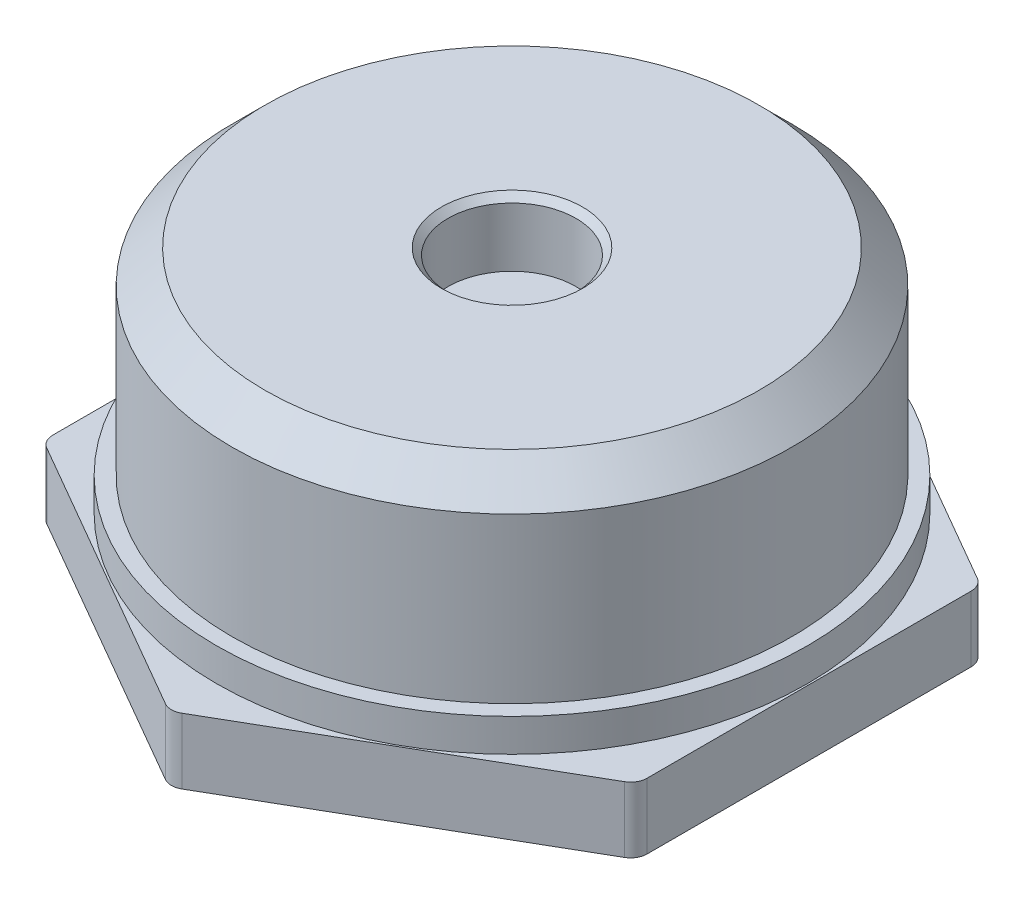
ISO-10303-21;
HEADER;
FILE_DESCRIPTION(('STEP AP214'),'2;1');
FILE_NAME('part.step','',(''),(''),'','','');
FILE_SCHEMA(('AUTOMOTIVE_DESIGN { 1 0 10303 214 1 1 1 1 }'));
ENDSEC;
DATA;
#1=APPLICATION_CONTEXT('core data for automotive mechanical design processes');
#2=APPLICATION_PROTOCOL_DEFINITION('international standard','automotive_design',2000,#1);
#3=PRODUCT_CONTEXT('',#1,'mechanical');
#4=PRODUCT('Part','Part','',(#3));
#5=PRODUCT_RELATED_PRODUCT_CATEGORY('part','',(#4));
#6=PRODUCT_DEFINITION_FORMATION('','',#4);
#7=PRODUCT_DEFINITION_CONTEXT('part definition',#1,'design');
#8=PRODUCT_DEFINITION('design','',#6,#7);
#9=PRODUCT_DEFINITION_SHAPE('','',#8);
#10=(LENGTH_UNIT() NAMED_UNIT(*) SI_UNIT(.MILLI.,.METRE.));
#11=(NAMED_UNIT(*) PLANE_ANGLE_UNIT() SI_UNIT($,.RADIAN.));
#12=(NAMED_UNIT(*) SI_UNIT($,.STERADIAN.) SOLID_ANGLE_UNIT());
#13=UNCERTAINTY_MEASURE_WITH_UNIT(LENGTH_MEASURE(1.E-05),#10,'distance_accuracy_value','');
#14=(GEOMETRIC_REPRESENTATION_CONTEXT(3) GLOBAL_UNCERTAINTY_ASSIGNED_CONTEXT((#13)) GLOBAL_UNIT_ASSIGNED_CONTEXT((#10,
#11,#12)) REPRESENTATION_CONTEXT('',''));
#15=CARTESIAN_POINT('',(0.,0.,0.));
#16=DIRECTION('',(0.,0.,1.));
#17=DIRECTION('',(1.,0.,0.));
#18=AXIS2_PLACEMENT_3D('',#15,#16,#17);
#19=CARTESIAN_POINT('',(2.5,31.,-1.44337567297407));
#20=DIRECTION('',(0.5,0.,-0.866025403784439));
#21=DIRECTION('',(-0.866025403784439,0.,-0.5));
#22=AXIS2_PLACEMENT_3D('',#19,#20,#21);
#23=PLANE('',#22);
#24=DIRECTION('',(0.866025403784439,0.,0.5));
#25=VECTOR('',#24,1.);
#26=CARTESIAN_POINT('',(2.5,37.,-1.44337567297407));
#27=LINE('',#26,#25);
#28=CARTESIAN_POINT('',(0.,37.,-2.88675134594813));
#29=VERTEX_POINT('',#28);
#30=CARTESIAN_POINT('',(2.5,37.,-1.44337567297407));
#31=VERTEX_POINT('',#30);
#32=EDGE_CURVE('E193',#29,#31,#27,.T.);
#33=ORIENTED_EDGE('',*,*,#32,.F.);
#34=DIRECTION('',(0.,1.,0.));
#35=VECTOR('',#34,1.);
#36=CARTESIAN_POINT('',(0.,31.,-2.88675134594813));
#37=LINE('',#36,#35);
#38=CARTESIAN_POINT('',(0.,31.,-2.88675134594813));
#39=VERTEX_POINT('',#38);
#40=EDGE_CURVE('E177',#39,#29,#37,.T.);
#41=ORIENTED_EDGE('',*,*,#40,.F.);
#42=DIRECTION('',(-0.866025403784439,0.,-0.5));
#43=VECTOR('',#42,1.);
#44=CARTESIAN_POINT('',(2.5,31.,-1.44337567297407));
#45=LINE('',#44,#43);
#46=CARTESIAN_POINT('',(2.5,31.,-1.44337567297407));
#47=VERTEX_POINT('',#46);
#48=EDGE_CURVE('E196',#47,#39,#45,.T.);
#49=ORIENTED_EDGE('',*,*,#48,.F.);
#50=DIRECTION('',(0.,1.,0.));
#51=VECTOR('',#50,1.);
#52=CARTESIAN_POINT('',(2.5,31.,-1.44337567297407));
#53=LINE('',#52,#51);
#54=EDGE_CURVE('E194',#47,#31,#53,.T.);
#55=ORIENTED_EDGE('',*,*,#54,.T.);
#56=EDGE_LOOP('',(#33,#41,#49,#55));
#57=FACE_BOUND('',#56,.T.);
#58=ADVANCED_FACE('F47',(#57),#23,.F.);
#59=CARTESIAN_POINT('',(2.5,31.,1.44337567297406));
#60=DIRECTION('',(1.,0.,0.));
#61=DIRECTION('',(0.,0.,-1.));
#62=AXIS2_PLACEMENT_3D('',#59,#60,#61);
#63=PLANE('',#62);
#64=DIRECTION('',(0.,0.,1.));
#65=VECTOR('',#64,1.);
#66=CARTESIAN_POINT('',(2.5,37.,1.44337567297406));
#67=LINE('',#66,#65);
#68=CARTESIAN_POINT('',(2.5,37.,1.44337567297406));
#69=VERTEX_POINT('',#68);
#70=EDGE_CURVE('E64',#31,#69,#67,.T.);
#71=ORIENTED_EDGE('',*,*,#70,.F.);
#72=ORIENTED_EDGE('',*,*,#54,.F.);
#73=DIRECTION('',(0.,0.,-1.));
#74=VECTOR('',#73,1.);
#75=CARTESIAN_POINT('',(2.5,31.,1.44337567297406));
#76=LINE('',#75,#74);
#77=CARTESIAN_POINT('',(2.5,31.,1.44337567297406));
#78=VERTEX_POINT('',#77);
#79=EDGE_CURVE('E190',#78,#47,#76,.T.);
#80=ORIENTED_EDGE('',*,*,#79,.F.);
#81=DIRECTION('',(0.,1.,0.));
#82=VECTOR('',#81,1.);
#83=CARTESIAN_POINT('',(2.5,31.,1.44337567297406));
#84=LINE('',#83,#82);
#85=EDGE_CURVE('E344',#78,#69,#84,.T.);
#86=ORIENTED_EDGE('',*,*,#85,.T.);
#87=EDGE_LOOP('',(#71,#72,#80,#86));
#88=FACE_BOUND('',#87,.T.);
#89=ADVANCED_FACE('F238',(#88),#63,.F.);
#90=CARTESIAN_POINT('',(0.,31.,2.88675134594813));
#91=DIRECTION('',(0.5,0.,0.866025403784439));
#92=DIRECTION('',(0.866025403784439,0.,-0.5));
#93=AXIS2_PLACEMENT_3D('',#90,#91,#92);
#94=PLANE('',#93);
#95=DIRECTION('',(-0.866025403784439,0.,0.5));
#96=VECTOR('',#95,1.);
#97=CARTESIAN_POINT('',(0.,37.,2.88675134594813));
#98=LINE('',#97,#96);
#99=CARTESIAN_POINT('',(0.,37.,2.88675134594813));
#100=VERTEX_POINT('',#99);
#101=EDGE_CURVE('E75',#69,#100,#98,.T.);
#102=ORIENTED_EDGE('',*,*,#101,.F.);
#103=ORIENTED_EDGE('',*,*,#85,.F.);
#104=DIRECTION('',(0.866025403784439,0.,-0.5));
#105=VECTOR('',#104,1.);
#106=CARTESIAN_POINT('',(0.,31.,2.88675134594813));
#107=LINE('',#106,#105);
#108=CARTESIAN_POINT('',(0.,31.,2.88675134594813));
#109=VERTEX_POINT('',#108);
#110=EDGE_CURVE('E468',#109,#78,#107,.T.);
#111=ORIENTED_EDGE('',*,*,#110,.F.);
#112=DIRECTION('',(0.,1.,0.));
#113=VECTOR('',#112,1.);
#114=CARTESIAN_POINT('',(0.,31.,2.88675134594813));
#115=LINE('',#114,#113);
#116=EDGE_CURVE('E480',#109,#100,#115,.T.);
#117=ORIENTED_EDGE('',*,*,#116,.T.);
#118=EDGE_LOOP('',(#102,#103,#111,#117));
#119=FACE_BOUND('',#118,.T.);
#120=ADVANCED_FACE('F244',(#119),#94,.F.);
#121=CARTESIAN_POINT('',(-2.5,31.,1.44337567297407));
#122=DIRECTION('',(-0.5,0.,0.866025403784439));
#123=DIRECTION('',(0.866025403784439,0.,0.5));
#124=AXIS2_PLACEMENT_3D('',#121,#122,#123);
#125=PLANE('',#124);
#126=DIRECTION('',(-0.866025403784439,0.,-0.5));
#127=VECTOR('',#126,1.);
#128=CARTESIAN_POINT('',(-2.5,37.,1.44337567297407));
#129=LINE('',#128,#127);
#130=CARTESIAN_POINT('',(-2.5,37.,1.44337567297407));
#131=VERTEX_POINT('',#130);
#132=EDGE_CURVE('E474',#100,#131,#129,.T.);
#133=ORIENTED_EDGE('',*,*,#132,.F.);
#134=ORIENTED_EDGE('',*,*,#116,.F.);
#135=DIRECTION('',(0.866025403784439,0.,0.5));
#136=VECTOR('',#135,1.);
#137=CARTESIAN_POINT('',(-2.5,31.,1.44337567297407));
#138=LINE('',#137,#136);
#139=CARTESIAN_POINT('',(-2.5,31.,1.44337567297407));
#140=VERTEX_POINT('',#139);
#141=EDGE_CURVE('E471',#140,#109,#138,.T.);
#142=ORIENTED_EDGE('',*,*,#141,.F.);
#143=DIRECTION('',(0.,1.,0.));
#144=VECTOR('',#143,1.);
#145=CARTESIAN_POINT('',(-2.5,31.,1.44337567297407));
#146=LINE('',#145,#144);
#147=EDGE_CURVE('E497',#140,#131,#146,.T.);
#148=ORIENTED_EDGE('',*,*,#147,.T.);
#149=EDGE_LOOP('',(#133,#134,#142,#148));
#150=FACE_BOUND('',#149,.T.);
#151=ADVANCED_FACE('F507',(#150),#125,.F.);
#152=CARTESIAN_POINT('',(-2.5,31.,-1.44337567297406));
#153=DIRECTION('',(-1.,0.,0.));
#154=DIRECTION('',(0.,0.,1.));
#155=AXIS2_PLACEMENT_3D('',#152,#153,#154);
#156=PLANE('',#155);
#157=DIRECTION('',(0.,0.,-1.));
#158=VECTOR('',#157,1.);
#159=CARTESIAN_POINT('',(-2.5,37.,-1.44337567297406));
#160=LINE('',#159,#158);
#161=CARTESIAN_POINT('',(-2.5,37.,-1.44337567297406));
#162=VERTEX_POINT('',#161);
#163=EDGE_CURVE('E201',#131,#162,#160,.T.);
#164=ORIENTED_EDGE('',*,*,#163,.F.);
#165=ORIENTED_EDGE('',*,*,#147,.F.);
#166=DIRECTION('',(0.,0.,1.));
#167=VECTOR('',#166,1.);
#168=CARTESIAN_POINT('',(-2.5,31.,-1.44337567297406));
#169=LINE('',#168,#167);
#170=CARTESIAN_POINT('',(-2.5,31.,-1.44337567297406));
#171=VERTEX_POINT('',#170);
#172=EDGE_CURVE('E487',#171,#140,#169,.T.);
#173=ORIENTED_EDGE('',*,*,#172,.F.);
#174=DIRECTION('',(0.,1.,0.));
#175=VECTOR('',#174,1.);
#176=CARTESIAN_POINT('',(-2.5,31.,-1.44337567297406));
#177=LINE('',#176,#175);
#178=EDGE_CURVE('E189',#171,#162,#177,.T.);
#179=ORIENTED_EDGE('',*,*,#178,.T.);
#180=EDGE_LOOP('',(#164,#165,#173,#179));
#181=FACE_BOUND('',#180,.T.);
#182=ADVANCED_FACE('F502',(#181),#156,.F.);
#183=CARTESIAN_POINT('',(0.,31.,-2.88675134594813));
#184=DIRECTION('',(-0.5,0.,-0.866025403784439));
#185=DIRECTION('',(-0.866025403784439,0.,0.5));
#186=AXIS2_PLACEMENT_3D('',#183,#184,#185);
#187=PLANE('',#186);
#188=DIRECTION('',(0.866025403784439,0.,-0.5));
#189=VECTOR('',#188,1.);
#190=CARTESIAN_POINT('',(0.,37.,-2.88675134594813));
#191=LINE('',#190,#189);
#192=EDGE_CURVE('E182',#162,#29,#191,.T.);
#193=ORIENTED_EDGE('',*,*,#192,.F.);
#194=ORIENTED_EDGE('',*,*,#178,.F.);
#195=DIRECTION('',(-0.866025403784439,0.,0.5));
#196=VECTOR('',#195,1.);
#197=CARTESIAN_POINT('',(0.,31.,-2.88675134594813));
#198=LINE('',#197,#196);
#199=EDGE_CURVE('E185',#39,#171,#198,.T.);
#200=ORIENTED_EDGE('',*,*,#199,.F.);
#201=ORIENTED_EDGE('',*,*,#40,.T.);
#202=EDGE_LOOP('',(#193,#194,#200,#201));
#203=FACE_BOUND('',#202,.T.);
#204=ADVANCED_FACE('F179',(#203),#187,.F.);
#205=CARTESIAN_POINT('',(9.05,33.,-5.22501993616611));
#206=DIRECTION('',(-0.5,0.,0.866025403784439));
#207=DIRECTION('',(0.866025403784439,0.,0.5));
#208=AXIS2_PLACEMENT_3D('',#205,#206,#207);
#209=PLANE('',#208);
#210=DIRECTION('',(-0.866025403784439,0.,-0.5));
#211=VECTOR('',#210,1.);
#212=CARTESIAN_POINT('',(9.05,31.,-5.22501993616611));
#213=LINE('',#212,#211);
#214=CARTESIAN_POINT('',(8.8,31.,-5.36935750346352));
#215=VERTEX_POINT('',#214);
#216=CARTESIAN_POINT('',(0.249999999999997,31.,-10.3057023050348));
#217=VERTEX_POINT('',#216);
#218=EDGE_CURVE('E338',#215,#217,#213,.T.);
#219=ORIENTED_EDGE('',*,*,#218,.T.);
#220=DIRECTION('',(0.,-1.,0.));
#221=VECTOR('',#220,1.);
#222=CARTESIAN_POINT('',(0.249999999999997,33.,-10.3057023050348));
#223=LINE('',#222,#221);
#224=CARTESIAN_POINT('',(0.249999999999997,33.,-10.3057023050348));
#225=VERTEX_POINT('',#224);
#226=EDGE_CURVE('E405',#217,#225,#223,.F.);
#227=ORIENTED_EDGE('',*,*,#226,.T.);
#228=DIRECTION('',(-0.866025403784439,0.,-0.5));
#229=VECTOR('',#228,1.);
#230=CARTESIAN_POINT('',(9.05,33.,-5.22501993616611));
#231=LINE('',#230,#229);
#232=CARTESIAN_POINT('',(8.8,33.,-5.36935750346352));
#233=VERTEX_POINT('',#232);
#234=EDGE_CURVE('E349',#233,#225,#231,.T.);
#235=ORIENTED_EDGE('',*,*,#234,.F.);
#236=DIRECTION('',(0.,-1.,0.));
#237=VECTOR('',#236,1.);
#238=CARTESIAN_POINT('',(8.8,33.,-5.36935750346352));
#239=LINE('',#238,#237);
#240=EDGE_CURVE('E402',#233,#215,#239,.T.);
#241=ORIENTED_EDGE('',*,*,#240,.T.);
#242=EDGE_LOOP('',(#219,#227,#235,#241));
#243=FACE_BOUND('',#242,.T.);
#244=ADVANCED_FACE('F290',(#243),#209,.F.);
#245=CARTESIAN_POINT('',(0.,33.,-10.4500398723322));
#246=DIRECTION('',(0.5,0.,0.866025403784439));
#247=DIRECTION('',(0.866025403784439,0.,-0.5));
#248=AXIS2_PLACEMENT_3D('',#245,#246,#247);
#249=PLANE('',#248);
#250=DIRECTION('',(-0.866025403784439,0.,0.5));
#251=VECTOR('',#250,1.);
#252=CARTESIAN_POINT('',(0.,33.,-10.4500398723322));
#253=LINE('',#252,#251);
#254=CARTESIAN_POINT('',(-0.250000000000002,33.,-10.3057023050348));
#255=VERTEX_POINT('',#254);
#256=CARTESIAN_POINT('',(-8.8,33.,-5.36935750346352));
#257=VERTEX_POINT('',#256);
#258=EDGE_CURVE('E352',#255,#257,#253,.T.);
#259=ORIENTED_EDGE('',*,*,#258,.F.);
#260=DIRECTION('',(0.,-1.,0.));
#261=VECTOR('',#260,1.);
#262=CARTESIAN_POINT('',(-0.250000000000002,33.,-10.3057023050348));
#263=LINE('',#262,#261);
#264=CARTESIAN_POINT('',(-0.250000000000002,31.,-10.3057023050348));
#265=VERTEX_POINT('',#264);
#266=EDGE_CURVE('E387',#255,#265,#263,.T.);
#267=ORIENTED_EDGE('',*,*,#266,.T.);
#268=DIRECTION('',(-0.866025403784439,0.,0.5));
#269=VECTOR('',#268,1.);
#270=CARTESIAN_POINT('',(0.,31.,-10.4500398723322));
#271=LINE('',#270,#269);
#272=CARTESIAN_POINT('',(-8.8,31.,-5.36935750346352));
#273=VERTEX_POINT('',#272);
#274=EDGE_CURVE('E342',#265,#273,#271,.T.);
#275=ORIENTED_EDGE('',*,*,#274,.T.);
#276=DIRECTION('',(0.,-1.,0.));
#277=VECTOR('',#276,1.);
#278=CARTESIAN_POINT('',(-8.8,33.,-5.36935750346352));
#279=LINE('',#278,#277);
#280=EDGE_CURVE('E369',#273,#257,#279,.F.);
#281=ORIENTED_EDGE('',*,*,#280,.T.);
#282=EDGE_LOOP('',(#259,#267,#275,#281));
#283=FACE_BOUND('',#282,.T.);
#284=ADVANCED_FACE('F286',(#283),#249,.F.);
#285=CARTESIAN_POINT('',(-9.05,33.,-5.22501993616612));
#286=DIRECTION('',(1.,0.,0.));
#287=DIRECTION('',(0.,0.,-1.));
#288=AXIS2_PLACEMENT_3D('',#285,#286,#287);
#289=PLANE('',#288);
#290=DIRECTION('',(0.,0.,1.));
#291=VECTOR('',#290,1.);
#292=CARTESIAN_POINT('',(-9.05,33.,-5.22501993616612));
#293=LINE('',#292,#291);
#294=CARTESIAN_POINT('',(-9.05,33.,-4.9363448015713));
#295=VERTEX_POINT('',#294);
#296=CARTESIAN_POINT('',(-9.05,33.,4.9363448015713));
#297=VERTEX_POINT('',#296);
#298=EDGE_CURVE('E357',#295,#297,#293,.T.);
#299=ORIENTED_EDGE('',*,*,#298,.F.);
#300=DIRECTION('',(0.,-1.,0.));
#301=VECTOR('',#300,1.);
#302=CARTESIAN_POINT('',(-9.05,33.,-4.9363448015713));
#303=LINE('',#302,#301);
#304=CARTESIAN_POINT('',(-9.05,31.,-4.9363448015713));
#305=VERTEX_POINT('',#304);
#306=EDGE_CURVE('E421',#295,#305,#303,.T.);
#307=ORIENTED_EDGE('',*,*,#306,.T.);
#308=DIRECTION('',(0.,0.,1.));
#309=VECTOR('',#308,1.);
#310=CARTESIAN_POINT('',(-9.05,31.,-5.22501993616612));
#311=LINE('',#310,#309);
#312=CARTESIAN_POINT('',(-9.05,31.,4.9363448015713));
#313=VERTEX_POINT('',#312);
#314=EDGE_CURVE('E374',#305,#313,#311,.T.);
#315=ORIENTED_EDGE('',*,*,#314,.T.);
#316=DIRECTION('',(0.,-1.,0.));
#317=VECTOR('',#316,1.);
#318=CARTESIAN_POINT('',(-9.05,33.,4.9363448015713));
#319=LINE('',#318,#317);
#320=EDGE_CURVE('E419',#313,#297,#319,.F.);
#321=ORIENTED_EDGE('',*,*,#320,.T.);
#322=EDGE_LOOP('',(#299,#307,#315,#321));
#323=FACE_BOUND('',#322,.T.);
#324=ADVANCED_FACE('F282',(#323),#289,.F.);
#325=CARTESIAN_POINT('',(-9.05,33.,5.22501993616611));
#326=DIRECTION('',(0.5,0.,-0.866025403784439));
#327=DIRECTION('',(-0.866025403784439,0.,-0.5));
#328=AXIS2_PLACEMENT_3D('',#325,#326,#327);
#329=PLANE('',#328);
#330=DIRECTION('',(0.866025403784439,0.,0.5));
#331=VECTOR('',#330,1.);
#332=CARTESIAN_POINT('',(-9.05,33.,5.22501993616611));
#333=LINE('',#332,#331);
#334=CARTESIAN_POINT('',(-8.8,33.,5.36935750346352));
#335=VERTEX_POINT('',#334);
#336=CARTESIAN_POINT('',(-0.25,33.,10.3057023050348));
#337=VERTEX_POINT('',#336);
#338=EDGE_CURVE('E360',#335,#337,#333,.T.);
#339=ORIENTED_EDGE('',*,*,#338,.F.);
#340=DIRECTION('',(0.,-1.,0.));
#341=VECTOR('',#340,1.);
#342=CARTESIAN_POINT('',(-8.8,33.,5.36935750346352));
#343=LINE('',#342,#341);
#344=CARTESIAN_POINT('',(-8.8,31.,5.36935750346352));
#345=VERTEX_POINT('',#344);
#346=EDGE_CURVE('E426',#335,#345,#343,.T.);
#347=ORIENTED_EDGE('',*,*,#346,.T.);
#348=DIRECTION('',(0.866025403784439,0.,0.5));
#349=VECTOR('',#348,1.);
#350=CARTESIAN_POINT('',(-9.05,31.,5.22501993616611));
#351=LINE('',#350,#349);
#352=CARTESIAN_POINT('',(-0.25,31.,10.3057023050348));
#353=VERTEX_POINT('',#352);
#354=EDGE_CURVE('E377',#345,#353,#351,.T.);
#355=ORIENTED_EDGE('',*,*,#354,.T.);
#356=DIRECTION('',(0.,-1.,0.));
#357=VECTOR('',#356,1.);
#358=CARTESIAN_POINT('',(-0.250000000000002,33.,10.3057023050348));
#359=LINE('',#358,#357);
#360=EDGE_CURVE('E424',#353,#337,#359,.F.);
#361=ORIENTED_EDGE('',*,*,#360,.T.);
#362=EDGE_LOOP('',(#339,#347,#355,#361));
#363=FACE_BOUND('',#362,.T.);
#364=ADVANCED_FACE('F278',(#363),#329,.F.);
#365=CARTESIAN_POINT('',(0.,33.,10.4500398723322));
#366=DIRECTION('',(-0.5,0.,-0.866025403784439));
#367=DIRECTION('',(-0.866025403784439,0.,0.5));
#368=AXIS2_PLACEMENT_3D('',#365,#366,#367);
#369=PLANE('',#368);
#370=DIRECTION('',(0.866025403784439,0.,-0.5));
#371=VECTOR('',#370,1.);
#372=CARTESIAN_POINT('',(0.,33.,10.4500398723322));
#373=LINE('',#372,#371);
#374=CARTESIAN_POINT('',(0.249999999999999,33.,10.3057023050348));
#375=VERTEX_POINT('',#374);
#376=CARTESIAN_POINT('',(8.8,33.,5.36935750346352));
#377=VERTEX_POINT('',#376);
#378=EDGE_CURVE('E363',#375,#377,#373,.T.);
#379=ORIENTED_EDGE('',*,*,#378,.F.);
#380=DIRECTION('',(0.,-1.,0.));
#381=VECTOR('',#380,1.);
#382=CARTESIAN_POINT('',(0.249999999999999,33.,10.3057023050348));
#383=LINE('',#382,#381);
#384=CARTESIAN_POINT('',(0.249999999999999,31.,10.3057023050348));
#385=VERTEX_POINT('',#384);
#386=EDGE_CURVE('E431',#375,#385,#383,.T.);
#387=ORIENTED_EDGE('',*,*,#386,.T.);
#388=DIRECTION('',(0.866025403784439,0.,-0.5));
#389=VECTOR('',#388,1.);
#390=CARTESIAN_POINT('',(0.,31.,10.4500398723322));
#391=LINE('',#390,#389);
#392=CARTESIAN_POINT('',(8.8,31.,5.36935750346352));
#393=VERTEX_POINT('',#392);
#394=EDGE_CURVE('E380',#385,#393,#391,.T.);
#395=ORIENTED_EDGE('',*,*,#394,.T.);
#396=DIRECTION('',(0.,-1.,0.));
#397=VECTOR('',#396,1.);
#398=CARTESIAN_POINT('',(8.8,33.,5.36935750346352));
#399=LINE('',#398,#397);
#400=EDGE_CURVE('E429',#393,#377,#399,.F.);
#401=ORIENTED_EDGE('',*,*,#400,.T.);
#402=EDGE_LOOP('',(#379,#387,#395,#401));
#403=FACE_BOUND('',#402,.T.);
#404=ADVANCED_FACE('F274',(#403),#369,.F.);
#405=CARTESIAN_POINT('',(9.05,33.,5.22501993616611));
#406=DIRECTION('',(-1.,0.,0.));
#407=DIRECTION('',(0.,0.,1.));
#408=AXIS2_PLACEMENT_3D('',#405,#406,#407);
#409=PLANE('',#408);
#410=DIRECTION('',(0.,0.,-1.));
#411=VECTOR('',#410,1.);
#412=CARTESIAN_POINT('',(9.05,33.,5.22501993616611));
#413=LINE('',#412,#411);
#414=CARTESIAN_POINT('',(9.05,33.,4.9363448015713));
#415=VERTEX_POINT('',#414);
#416=CARTESIAN_POINT('',(9.05,33.,-4.9363448015713));
#417=VERTEX_POINT('',#416);
#418=EDGE_CURVE('E367',#415,#417,#413,.T.);
#419=ORIENTED_EDGE('',*,*,#418,.F.);
#420=DIRECTION('',(0.,-1.,0.));
#421=VECTOR('',#420,1.);
#422=CARTESIAN_POINT('',(9.05,33.,4.9363448015713));
#423=LINE('',#422,#421);
#424=CARTESIAN_POINT('',(9.05,31.,4.9363448015713));
#425=VERTEX_POINT('',#424);
#426=EDGE_CURVE('E214',#415,#425,#423,.T.);
#427=ORIENTED_EDGE('',*,*,#426,.T.);
#428=DIRECTION('',(0.,0.,-1.));
#429=VECTOR('',#428,1.);
#430=CARTESIAN_POINT('',(9.05,31.,5.22501993616611));
#431=LINE('',#430,#429);
#432=CARTESIAN_POINT('',(9.05,31.,-4.9363448015713));
#433=VERTEX_POINT('',#432);
#434=EDGE_CURVE('E353',#425,#433,#431,.T.);
#435=ORIENTED_EDGE('',*,*,#434,.T.);
#436=DIRECTION('',(0.,-1.,0.));
#437=VECTOR('',#436,1.);
#438=CARTESIAN_POINT('',(9.05,33.,-4.9363448015713));
#439=LINE('',#438,#437);
#440=EDGE_CURVE('E433',#433,#417,#439,.F.);
#441=ORIENTED_EDGE('',*,*,#440,.T.);
#442=EDGE_LOOP('',(#419,#427,#435,#441));
#443=FACE_BOUND('',#442,.T.);
#444=ADVANCED_FACE('F266',(#443),#409,.F.);
#445=CARTESIAN_POINT('',(0.,33.,0.));
#446=DIRECTION('',(0.,1.,0.));
#447=DIRECTION('',(0.,0.,1.));
#448=AXIS2_PLACEMENT_3D('',#445,#446,#447);
#449=PLANE('',#448);
#450=CARTESIAN_POINT('',(0.,33.,0.));
#451=DIRECTION('',(0.,1.,0.));
#452=DIRECTION('',(0.,0.,1.));
#453=AXIS2_PLACEMENT_3D('',#450,#451,#452);
#454=CIRCLE('',#453,9.00000000000006);
#455=CARTESIAN_POINT('',(0.,33.,9.00000000000006));
#456=VERTEX_POINT('',#455);
#457=EDGE_CURVE('E211',#456,#456,#454,.T.);
#458=ORIENTED_EDGE('',*,*,#457,.F.);
#459=EDGE_LOOP('',(#458));
#460=FACE_BOUND('',#459,.T.);
#461=ORIENTED_EDGE('',*,*,#234,.T.);
#462=CARTESIAN_POINT('',(0.,33.,-9.8726896031426));
#463=DIRECTION('',(0.,1.,0.));
#464=DIRECTION('',(0.,0.,1.));
#465=AXIS2_PLACEMENT_3D('',#462,#463,#464);
#466=CIRCLE('',#465,0.5);
#467=EDGE_CURVE('E417',#225,#255,#466,.T.);
#468=ORIENTED_EDGE('',*,*,#467,.T.);
#469=ORIENTED_EDGE('',*,*,#258,.T.);
#470=CARTESIAN_POINT('',(-8.55,33.,-4.9363448015713));
#471=DIRECTION('',(0.,1.,0.));
#472=DIRECTION('',(0.,0.,1.));
#473=AXIS2_PLACEMENT_3D('',#470,#471,#472);
#474=CIRCLE('',#473,0.5);
#475=EDGE_CURVE('E415',#257,#295,#474,.T.);
#476=ORIENTED_EDGE('',*,*,#475,.T.);
#477=ORIENTED_EDGE('',*,*,#298,.T.);
#478=CARTESIAN_POINT('',(-8.55,33.,4.9363448015713));
#479=DIRECTION('',(0.,1.,0.));
#480=DIRECTION('',(0.,0.,1.));
#481=AXIS2_PLACEMENT_3D('',#478,#479,#480);
#482=CIRCLE('',#481,0.5);
#483=EDGE_CURVE('E413',#297,#335,#482,.T.);
#484=ORIENTED_EDGE('',*,*,#483,.T.);
#485=ORIENTED_EDGE('',*,*,#338,.T.);
#486=CARTESIAN_POINT('',(0.,33.,9.8726896031426));
#487=DIRECTION('',(0.,1.,0.));
#488=DIRECTION('',(0.,0.,1.));
#489=AXIS2_PLACEMENT_3D('',#486,#487,#488);
#490=CIRCLE('',#489,0.5);
#491=EDGE_CURVE('E411',#337,#375,#490,.T.);
#492=ORIENTED_EDGE('',*,*,#491,.T.);
#493=ORIENTED_EDGE('',*,*,#378,.T.);
#494=CARTESIAN_POINT('',(8.55,33.,4.9363448015713));
#495=DIRECTION('',(0.,1.,0.));
#496=DIRECTION('',(0.,0.,1.));
#497=AXIS2_PLACEMENT_3D('',#494,#495,#496);
#498=CIRCLE('',#497,0.5);
#499=EDGE_CURVE('E409',#377,#415,#498,.T.);
#500=ORIENTED_EDGE('',*,*,#499,.T.);
#501=ORIENTED_EDGE('',*,*,#418,.T.);
#502=CARTESIAN_POINT('',(8.55,33.,-4.9363448015713));
#503=DIRECTION('',(0.,1.,0.));
#504=DIRECTION('',(0.,0.,1.));
#505=AXIS2_PLACEMENT_3D('',#502,#503,#504);
#506=CIRCLE('',#505,0.5);
#507=EDGE_CURVE('E407',#417,#233,#506,.T.);
#508=ORIENTED_EDGE('',*,*,#507,.T.);
#509=EDGE_LOOP('',(#461,#468,#469,#476,#477,#484,#485,#492,#493,#500,#501,#508));
#510=FACE_BOUND('',#509,.T.);
#511=ADVANCED_FACE('F262',(#460,#510),#449,.T.);
#512=CARTESIAN_POINT('',(0.,31.,0.));
#513=DIRECTION('',(0.,1.,0.));
#514=DIRECTION('',(0.,0.,1.));
#515=AXIS2_PLACEMENT_3D('',#512,#513,#514);
#516=PLANE('',#515);
#517=ORIENTED_EDGE('',*,*,#79,.T.);
#518=ORIENTED_EDGE('',*,*,#48,.T.);
#519=ORIENTED_EDGE('',*,*,#199,.T.);
#520=ORIENTED_EDGE('',*,*,#172,.T.);
#521=ORIENTED_EDGE('',*,*,#141,.T.);
#522=ORIENTED_EDGE('',*,*,#110,.T.);
#523=EDGE_LOOP('',(#517,#518,#519,#520,#521,#522));
#524=FACE_BOUND('',#523,.T.);
#525=ORIENTED_EDGE('',*,*,#274,.F.);
#526=CARTESIAN_POINT('',(0.,31.,-9.8726896031426));
#527=DIRECTION('',(0.,1.,0.));
#528=DIRECTION('',(0.,0.,1.));
#529=AXIS2_PLACEMENT_3D('',#526,#527,#528);
#530=CIRCLE('',#529,0.5);
#531=EDGE_CURVE('E400',#265,#217,#530,.F.);
#532=ORIENTED_EDGE('',*,*,#531,.T.);
#533=ORIENTED_EDGE('',*,*,#218,.F.);
#534=CARTESIAN_POINT('',(8.55,31.,-4.9363448015713));
#535=DIRECTION('',(0.,1.,0.));
#536=DIRECTION('',(0.,0.,1.));
#537=AXIS2_PLACEMENT_3D('',#534,#535,#536);
#538=CIRCLE('',#537,0.5);
#539=EDGE_CURVE('E390',#215,#433,#538,.F.);
#540=ORIENTED_EDGE('',*,*,#539,.T.);
#541=ORIENTED_EDGE('',*,*,#434,.F.);
#542=CARTESIAN_POINT('',(8.55,31.,4.9363448015713));
#543=DIRECTION('',(0.,1.,0.));
#544=DIRECTION('',(0.,0.,1.));
#545=AXIS2_PLACEMENT_3D('',#542,#543,#544);
#546=CIRCLE('',#545,0.5);
#547=EDGE_CURVE('E392',#425,#393,#546,.F.);
#548=ORIENTED_EDGE('',*,*,#547,.T.);
#549=ORIENTED_EDGE('',*,*,#394,.F.);
#550=CARTESIAN_POINT('',(0.,31.,9.8726896031426));
#551=DIRECTION('',(0.,1.,0.));
#552=DIRECTION('',(0.,0.,1.));
#553=AXIS2_PLACEMENT_3D('',#550,#551,#552);
#554=CIRCLE('',#553,0.5);
#555=EDGE_CURVE('E394',#385,#353,#554,.F.);
#556=ORIENTED_EDGE('',*,*,#555,.T.);
#557=ORIENTED_EDGE('',*,*,#354,.F.);
#558=CARTESIAN_POINT('',(-8.55,31.,4.9363448015713));
#559=DIRECTION('',(0.,1.,0.));
#560=DIRECTION('',(0.,0.,1.));
#561=AXIS2_PLACEMENT_3D('',#558,#559,#560);
#562=CIRCLE('',#561,0.5);
#563=EDGE_CURVE('E396',#345,#313,#562,.F.);
#564=ORIENTED_EDGE('',*,*,#563,.T.);
#565=ORIENTED_EDGE('',*,*,#314,.F.);
#566=CARTESIAN_POINT('',(-8.55,31.,-4.9363448015713));
#567=DIRECTION('',(0.,1.,0.));
#568=DIRECTION('',(0.,0.,1.));
#569=AXIS2_PLACEMENT_3D('',#566,#567,#568);
#570=CIRCLE('',#569,0.5);
#571=EDGE_CURVE('E398',#305,#273,#570,.F.);
#572=ORIENTED_EDGE('',*,*,#571,.T.);
#573=EDGE_LOOP('',(#525,#532,#533,#540,#541,#548,#549,#556,#557,#564,#565,#572));
#574=FACE_BOUND('',#573,.T.);
#575=ADVANCED_FACE('F265',(#524,#574),#516,.F.);
#576=CARTESIAN_POINT('',(0.,33.,-9.8726896031426));
#577=DIRECTION('',(0.,-1.,0.));
#578=DIRECTION('',(0.,0.,-1.));
#579=AXIS2_PLACEMENT_3D('',#576,#577,#578);
#580=CYLINDRICAL_SURFACE('',#579,0.5);
#581=ORIENTED_EDGE('',*,*,#467,.F.);
#582=ORIENTED_EDGE('',*,*,#226,.F.);
#583=ORIENTED_EDGE('',*,*,#531,.F.);
#584=ORIENTED_EDGE('',*,*,#266,.F.);
#585=EDGE_LOOP('',(#581,#582,#583,#584));
#586=FACE_BOUND('',#585,.T.);
#587=ADVANCED_FACE('F270',(#586),#580,.T.);
#588=CARTESIAN_POINT('',(-8.55,33.,-4.9363448015713));
#589=DIRECTION('',(0.,-1.,0.));
#590=DIRECTION('',(0.,0.,-1.));
#591=AXIS2_PLACEMENT_3D('',#588,#589,#590);
#592=CYLINDRICAL_SURFACE('',#591,0.5);
#593=ORIENTED_EDGE('',*,*,#475,.F.);
#594=ORIENTED_EDGE('',*,*,#280,.F.);
#595=ORIENTED_EDGE('',*,*,#571,.F.);
#596=ORIENTED_EDGE('',*,*,#306,.F.);
#597=EDGE_LOOP('',(#593,#594,#595,#596));
#598=FACE_BOUND('',#597,.T.);
#599=ADVANCED_FACE('F297',(#598),#592,.T.);
#600=CARTESIAN_POINT('',(-8.55,33.,4.9363448015713));
#601=DIRECTION('',(0.,-1.,0.));
#602=DIRECTION('',(0.,0.,-1.));
#603=AXIS2_PLACEMENT_3D('',#600,#601,#602);
#604=CYLINDRICAL_SURFACE('',#603,0.5);
#605=ORIENTED_EDGE('',*,*,#483,.F.);
#606=ORIENTED_EDGE('',*,*,#320,.F.);
#607=ORIENTED_EDGE('',*,*,#563,.F.);
#608=ORIENTED_EDGE('',*,*,#346,.F.);
#609=EDGE_LOOP('',(#605,#606,#607,#608));
#610=FACE_BOUND('',#609,.T.);
#611=ADVANCED_FACE('F301',(#610),#604,.T.);
#612=CARTESIAN_POINT('',(0.,33.,9.8726896031426));
#613=DIRECTION('',(0.,-1.,0.));
#614=DIRECTION('',(0.,0.,-1.));
#615=AXIS2_PLACEMENT_3D('',#612,#613,#614);
#616=CYLINDRICAL_SURFACE('',#615,0.5);
#617=ORIENTED_EDGE('',*,*,#491,.F.);
#618=ORIENTED_EDGE('',*,*,#360,.F.);
#619=ORIENTED_EDGE('',*,*,#555,.F.);
#620=ORIENTED_EDGE('',*,*,#386,.F.);
#621=EDGE_LOOP('',(#617,#618,#619,#620));
#622=FACE_BOUND('',#621,.T.);
#623=ADVANCED_FACE('F305',(#622),#616,.T.);
#624=CARTESIAN_POINT('',(8.55,33.,4.9363448015713));
#625=DIRECTION('',(0.,-1.,0.));
#626=DIRECTION('',(0.,0.,-1.));
#627=AXIS2_PLACEMENT_3D('',#624,#625,#626);
#628=CYLINDRICAL_SURFACE('',#627,0.5);
#629=ORIENTED_EDGE('',*,*,#499,.F.);
#630=ORIENTED_EDGE('',*,*,#400,.F.);
#631=ORIENTED_EDGE('',*,*,#547,.F.);
#632=ORIENTED_EDGE('',*,*,#426,.F.);
#633=EDGE_LOOP('',(#629,#630,#631,#632));
#634=FACE_BOUND('',#633,.T.);
#635=ADVANCED_FACE('F309',(#634),#628,.T.);
#636=CARTESIAN_POINT('',(8.55,33.,-4.9363448015713));
#637=DIRECTION('',(0.,-1.,0.));
#638=DIRECTION('',(0.,0.,-1.));
#639=AXIS2_PLACEMENT_3D('',#636,#637,#638);
#640=CYLINDRICAL_SURFACE('',#639,0.5);
#641=ORIENTED_EDGE('',*,*,#507,.F.);
#642=ORIENTED_EDGE('',*,*,#440,.F.);
#643=ORIENTED_EDGE('',*,*,#539,.F.);
#644=ORIENTED_EDGE('',*,*,#240,.F.);
#645=EDGE_LOOP('',(#641,#642,#643,#644));
#646=FACE_BOUND('',#645,.T.);
#647=ADVANCED_FACE('F260',(#646),#640,.T.);
#648=CARTESIAN_POINT('',(0.,34.,0.));
#649=DIRECTION('',(0.,-1.,0.));
#650=DIRECTION('',(0.,0.,-1.));
#651=AXIS2_PLACEMENT_3D('',#648,#649,#650);
#652=CYLINDRICAL_SURFACE('',#651,9.00000000000006);
#653=CARTESIAN_POINT('',(0.,34.,0.));
#654=DIRECTION('',(0.,1.,0.));
#655=DIRECTION('',(0.,0.,1.));
#656=AXIS2_PLACEMENT_3D('',#653,#654,#655);
#657=CIRCLE('',#656,9.00000000000006);
#658=CARTESIAN_POINT('',(0.,34.,9.00000000000006));
#659=VERTEX_POINT('',#658);
#660=EDGE_CURVE('E336',#659,#659,#657,.T.);
#661=ORIENTED_EDGE('',*,*,#660,.F.);
#662=EDGE_LOOP('',(#661));
#663=FACE_BOUND('',#662,.T.);
#664=ORIENTED_EDGE('',*,*,#457,.T.);
#665=EDGE_LOOP('',(#664));
#666=FACE_BOUND('',#665,.T.);
#667=ADVANCED_FACE('F256',(#663,#666),#652,.T.);
#668=CARTESIAN_POINT('',(0.,34.,0.));
#669=DIRECTION('',(0.,1.,0.));
#670=DIRECTION('',(0.,0.,1.));
#671=AXIS2_PLACEMENT_3D('',#668,#669,#670);
#672=PLANE('',#671);
#673=CARTESIAN_POINT('',(0.,34.,0.));
#674=DIRECTION('',(0.,1.,0.));
#675=DIRECTION('',(0.,0.,1.));
#676=AXIS2_PLACEMENT_3D('',#673,#674,#675);
#677=CIRCLE('',#676,8.525);
#678=CARTESIAN_POINT('',(0.,34.,8.525));
#679=VERTEX_POINT('',#678);
#680=EDGE_CURVE('E203',#679,#679,#677,.T.);
#681=ORIENTED_EDGE('',*,*,#680,.F.);
#682=EDGE_LOOP('',(#681));
#683=FACE_BOUND('',#682,.T.);
#684=ORIENTED_EDGE('',*,*,#660,.T.);
#685=EDGE_LOOP('',(#684));
#686=FACE_BOUND('',#685,.T.);
#687=ADVANCED_FACE('F252',(#683,#686),#672,.T.);
#688=CARTESIAN_POINT('',(0.,38.,0.));
#689=DIRECTION('',(0.,-1.,0.));
#690=DIRECTION('',(0.,0.,-1.));
#691=AXIS2_PLACEMENT_3D('',#688,#689,#690);
#692=CYLINDRICAL_SURFACE('',#691,8.525);
#693=CARTESIAN_POINT('',(0.,39.,0.));
#694=DIRECTION('',(0.,1.,0.));
#695=DIRECTION('',(0.,0.,1.));
#696=AXIS2_PLACEMENT_3D('',#693,#694,#695);
#697=CIRCLE('',#696,8.525);
#698=CARTESIAN_POINT('',(0.,39.,8.525));
#699=VERTEX_POINT('',#698);
#700=EDGE_CURVE('E207',#699,#699,#697,.F.);
#701=ORIENTED_EDGE('',*,*,#700,.T.);
#702=EDGE_LOOP('',(#701));
#703=FACE_BOUND('',#702,.T.);
#704=ORIENTED_EDGE('',*,*,#680,.T.);
#705=EDGE_LOOP('',(#704));
#706=FACE_BOUND('',#705,.T.);
#707=ADVANCED_FACE('F249',(#703,#706),#692,.T.);
#708=CARTESIAN_POINT('',(0.,37.,0.));
#709=DIRECTION('',(0.,1.,0.));
#710=DIRECTION('',(0.,0.,1.));
#711=AXIS2_PLACEMENT_3D('',#708,#709,#710);
#712=PLANE('',#711);
#713=ORIENTED_EDGE('',*,*,#192,.T.);
#714=ORIENTED_EDGE('',*,*,#32,.T.);
#715=ORIENTED_EDGE('',*,*,#70,.T.);
#716=ORIENTED_EDGE('',*,*,#101,.T.);
#717=ORIENTED_EDGE('',*,*,#132,.T.);
#718=ORIENTED_EDGE('',*,*,#163,.T.);
#719=EDGE_LOOP('',(#713,#714,#715,#716,#717,#718));
#720=FACE_BOUND('',#719,.T.);
#721=ADVANCED_FACE('F199',(#720),#712,.F.);
#722=CARTESIAN_POINT('',(0.,40.,0.));
#723=DIRECTION('',(0.,1.,0.));
#724=DIRECTION('',(0.,0.,1.));
#725=AXIS2_PLACEMENT_3D('',#722,#723,#724);
#726=PLANE('',#725);
#727=CARTESIAN_POINT('',(0.,40.,0.));
#728=DIRECTION('',(0.,1.,0.));
#729=DIRECTION('',(0.,0.,1.));
#730=AXIS2_PLACEMENT_3D('',#727,#728,#729);
#731=CIRCLE('',#730,2.15000000000001);
#732=CARTESIAN_POINT('',(0.,40.,2.15000000000001));
#733=VERTEX_POINT('',#732);
#734=EDGE_CURVE('E11',#733,#733,#731,.F.);
#735=ORIENTED_EDGE('',*,*,#734,.T.);
#736=EDGE_LOOP('',(#735));
#737=FACE_BOUND('',#736,.T.);
#738=CARTESIAN_POINT('',(0.,40.,0.));
#739=DIRECTION('',(0.,1.,0.));
#740=DIRECTION('',(0.,0.,1.));
#741=AXIS2_PLACEMENT_3D('',#738,#739,#740);
#742=CIRCLE('',#741,7.525);
#743=CARTESIAN_POINT('',(0.,40.,7.525));
#744=VERTEX_POINT('',#743);
#745=EDGE_CURVE('E202',#744,#744,#742,.T.);
#746=ORIENTED_EDGE('',*,*,#745,.T.);
#747=EDGE_LOOP('',(#746));
#748=FACE_BOUND('',#747,.T.);
#749=ADVANCED_FACE('F320',(#737,#748),#726,.T.);
#750=CARTESIAN_POINT('',(0.,40.,0.));
#751=DIRECTION('',(0.,-1.,0.));
#752=DIRECTION('',(0.,0.,-1.));
#753=AXIS2_PLACEMENT_3D('',#750,#751,#752);
#754=CONICAL_SURFACE('',#753,7.525,0.785398163397441);
#755=ORIENTED_EDGE('',*,*,#700,.F.);
#756=EDGE_LOOP('',(#755));
#757=FACE_BOUND('',#756,.T.);
#758=ORIENTED_EDGE('',*,*,#745,.F.);
#759=EDGE_LOOP('',(#758));
#760=FACE_BOUND('',#759,.T.);
#761=ADVANCED_FACE('F317',(#757,#760),#754,.T.);
#762=CARTESIAN_POINT('',(0.,38.,0.));
#763=DIRECTION('',(0.,1.,0.));
#764=DIRECTION('',(0.,0.,1.));
#765=AXIS2_PLACEMENT_3D('',#762,#763,#764);
#766=CYLINDRICAL_SURFACE('',#765,1.95);
#767=CARTESIAN_POINT('',(0.,39.8,0.));
#768=DIRECTION('',(0.,1.,0.));
#769=DIRECTION('',(0.,0.,1.));
#770=AXIS2_PLACEMENT_3D('',#767,#768,#769);
#771=CIRCLE('',#770,1.95);
#772=CARTESIAN_POINT('',(0.,39.8,1.95));
#773=VERTEX_POINT('',#772);
#774=EDGE_CURVE('E57',#773,#773,#771,.T.);
#775=ORIENTED_EDGE('',*,*,#774,.T.);
#776=EDGE_LOOP('',(#775));
#777=FACE_BOUND('',#776,.T.);
#778=CARTESIAN_POINT('',(0.,38.,0.));
#779=DIRECTION('',(0.,1.,0.));
#780=DIRECTION('',(0.,0.,1.));
#781=AXIS2_PLACEMENT_3D('',#778,#779,#780);
#782=CIRCLE('',#781,1.95);
#783=CARTESIAN_POINT('',(0.,38.,1.95));
#784=VERTEX_POINT('',#783);
#785=EDGE_CURVE('E475',#784,#784,#782,.T.);
#786=ORIENTED_EDGE('',*,*,#785,.F.);
#787=EDGE_LOOP('',(#786));
#788=FACE_BOUND('',#787,.T.);
#789=ADVANCED_FACE('F224',(#777,#788),#766,.F.);
#790=CARTESIAN_POINT('',(0.,38.,0.));
#791=DIRECTION('',(0.,1.,0.));
#792=DIRECTION('',(0.,0.,1.));
#793=AXIS2_PLACEMENT_3D('',#790,#791,#792);
#794=PLANE('',#793);
#795=ORIENTED_EDGE('',*,*,#785,.T.);
#796=EDGE_LOOP('',(#795));
#797=FACE_BOUND('',#796,.T.);
#798=ADVANCED_FACE('F228',(#797),#794,.T.);
#799=CARTESIAN_POINT('',(0.,39.8,0.));
#800=DIRECTION('',(0.,1.,0.));
#801=DIRECTION('',(0.,0.,1.));
#802=AXIS2_PLACEMENT_3D('',#799,#800,#801);
#803=CONICAL_SURFACE('',#802,1.95,0.785398163397449);
#804=ORIENTED_EDGE('',*,*,#734,.F.);
#805=EDGE_LOOP('',(#804));
#806=FACE_BOUND('',#805,.T.);
#807=ORIENTED_EDGE('',*,*,#774,.F.);
#808=EDGE_LOOP('',(#807));
#809=FACE_BOUND('',#808,.T.);
#810=ADVANCED_FACE('F50',(#806,#809),#803,.F.);
#811=CLOSED_SHELL('',(#58,#89,#120,#151,#182,#204,#244,#284,#324,#364,#404,#444,#511,#575,#587,
#599,#611,#623,#635,#647,#667,#687,#707,#721,#749,#761,#789,#798,#810));
#812=MANIFOLD_SOLID_BREP('B2',#811);
#813=ADVANCED_BREP_SHAPE_REPRESENTATION('',(#18,#812),#14);
#814=SHAPE_DEFINITION_REPRESENTATION(#9,#813);
ENDSEC;
END-ISO-10303-21;
